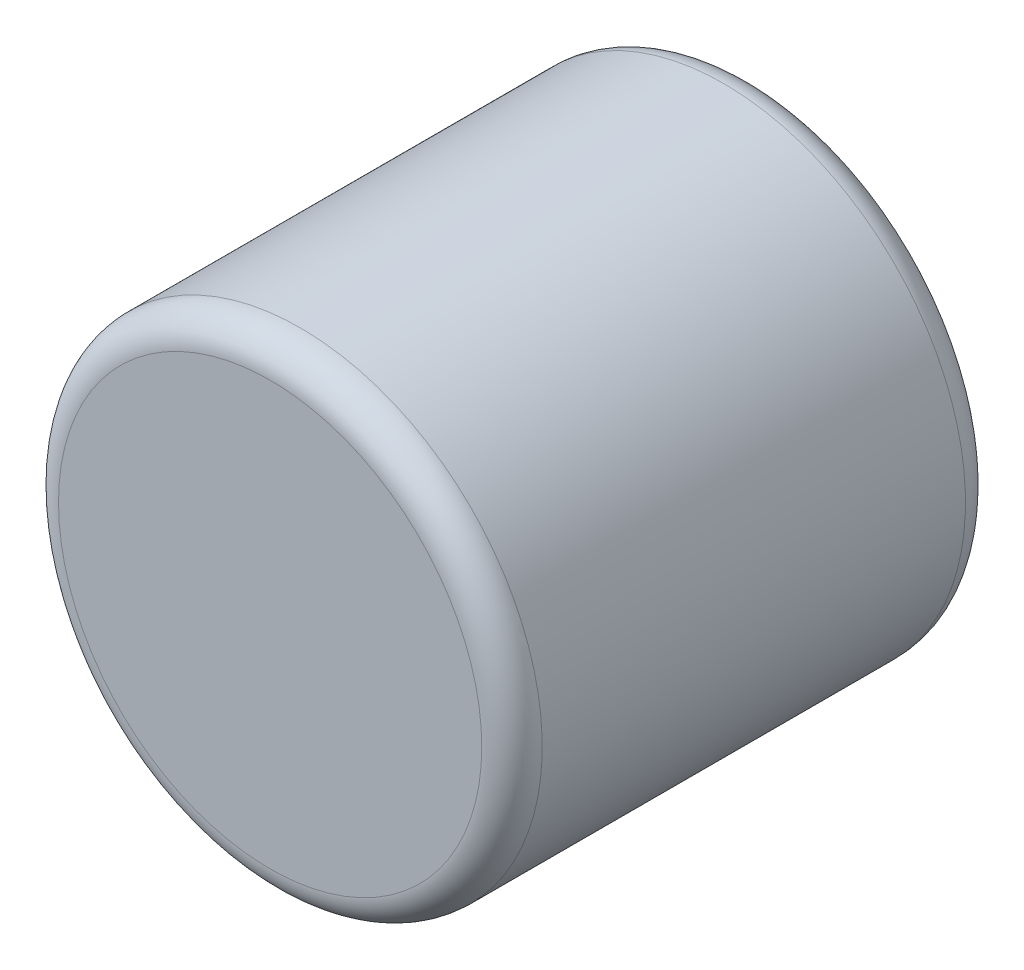
ISO-10303-21;
HEADER;
FILE_DESCRIPTION(('STEP AP214'),'2;1');
FILE_NAME('part.step','',(''),(''),'','','');
FILE_SCHEMA(('AUTOMOTIVE_DESIGN { 1 0 10303 214 1 1 1 1 }'));
ENDSEC;
DATA;
#1=APPLICATION_CONTEXT('core data for automotive mechanical design processes');
#2=APPLICATION_PROTOCOL_DEFINITION('international standard','automotive_design',2000,#1);
#3=PRODUCT_CONTEXT('',#1,'mechanical');
#4=PRODUCT('Part','Part','',(#3));
#5=PRODUCT_RELATED_PRODUCT_CATEGORY('part','',(#4));
#6=PRODUCT_DEFINITION_FORMATION('','',#4);
#7=PRODUCT_DEFINITION_CONTEXT('part definition',#1,'design');
#8=PRODUCT_DEFINITION('design','',#6,#7);
#9=PRODUCT_DEFINITION_SHAPE('','',#8);
#10=(LENGTH_UNIT() NAMED_UNIT(*) SI_UNIT(.MILLI.,.METRE.));
#11=(NAMED_UNIT(*) PLANE_ANGLE_UNIT() SI_UNIT($,.RADIAN.));
#12=(NAMED_UNIT(*) SI_UNIT($,.STERADIAN.) SOLID_ANGLE_UNIT());
#13=UNCERTAINTY_MEASURE_WITH_UNIT(LENGTH_MEASURE(1.E-05),#10,'distance_accuracy_value','');
#14=(GEOMETRIC_REPRESENTATION_CONTEXT(3) GLOBAL_UNCERTAINTY_ASSIGNED_CONTEXT((#13)) GLOBAL_UNIT_ASSIGNED_CONTEXT((#10,
#11,#12)) REPRESENTATION_CONTEXT('',''));
#15=CARTESIAN_POINT('',(0.,0.,0.));
#16=DIRECTION('',(0.,0.,1.));
#17=DIRECTION('',(1.,0.,0.));
#18=AXIS2_PLACEMENT_3D('',#15,#16,#17);
#19=CARTESIAN_POINT('',(0.,0.,8.));
#20=DIRECTION('',(0.,0.,1.));
#21=DIRECTION('',(1.,0.,0.));
#22=AXIS2_PLACEMENT_3D('',#19,#20,#21);
#23=PLANE('',#22);
#24=CARTESIAN_POINT('',(0.,0.,8.));
#25=DIRECTION('',(0.,0.,-1.));
#26=DIRECTION('',(-1.,0.,0.));
#27=AXIS2_PLACEMENT_3D('',#24,#25,#26);
#28=CIRCLE('',#27,3.5);
#29=CARTESIAN_POINT('',(-3.5,0.,8.));
#30=VERTEX_POINT('',#29);
#31=CARTESIAN_POINT('',(3.5,0.,8.));
#32=VERTEX_POINT('',#31);
#33=EDGE_CURVE('E49',#30,#32,#28,.T.);
#34=ORIENTED_EDGE('',*,*,#33,.F.);
#35=CARTESIAN_POINT('',(0.,0.,8.));
#36=DIRECTION('',(0.,0.,-1.));
#37=DIRECTION('',(1.,0.,0.));
#38=AXIS2_PLACEMENT_3D('',#35,#36,#37);
#39=CIRCLE('',#38,3.5);
#40=EDGE_CURVE('E45',#32,#30,#39,.T.);
#41=ORIENTED_EDGE('',*,*,#40,.F.);
#42=EDGE_LOOP('',(#34,#41));
#43=FACE_BOUND('',#42,.T.);
#44=ADVANCED_FACE('F16',(#43),#23,.T.);
#45=CARTESIAN_POINT('',(0.,0.,0.));
#46=DIRECTION('',(0.,0.,1.));
#47=DIRECTION('',(1.,0.,0.));
#48=AXIS2_PLACEMENT_3D('',#45,#46,#47);
#49=PLANE('',#48);
#50=CARTESIAN_POINT('',(0.,0.,0.));
#51=DIRECTION('',(0.,0.,1.));
#52=DIRECTION('',(1.,0.,0.));
#53=AXIS2_PLACEMENT_3D('',#50,#51,#52);
#54=CIRCLE('',#53,3.5);
#55=CARTESIAN_POINT('',(3.5,0.,0.));
#56=VERTEX_POINT('',#55);
#57=CARTESIAN_POINT('',(-3.5,0.,0.));
#58=VERTEX_POINT('',#57);
#59=EDGE_CURVE('E56',#56,#58,#54,.T.);
#60=ORIENTED_EDGE('',*,*,#59,.F.);
#61=CARTESIAN_POINT('',(0.,0.,0.));
#62=DIRECTION('',(0.,0.,1.));
#63=DIRECTION('',(-1.,0.,0.));
#64=AXIS2_PLACEMENT_3D('',#61,#62,#63);
#65=CIRCLE('',#64,3.5);
#66=EDGE_CURVE('E36',#58,#56,#65,.T.);
#67=ORIENTED_EDGE('',*,*,#66,.F.);
#68=EDGE_LOOP('',(#60,#67));
#69=FACE_BOUND('',#68,.T.);
#70=ADVANCED_FACE('F74',(#69),#49,.F.);
#71=CARTESIAN_POINT('',(0.,0.,7.5));
#72=DIRECTION('',(0.,0.,1.));
#73=DIRECTION('',(1.,0.,0.));
#74=AXIS2_PLACEMENT_3D('',#71,#72,#73);
#75=TOROIDAL_SURFACE('',#74,3.5,0.5);
#76=ORIENTED_EDGE('',*,*,#40,.T.);
#77=ORIENTED_EDGE('',*,*,#33,.T.);
#78=EDGE_LOOP('',(#76,#77));
#79=FACE_BOUND('',#78,.T.);
#80=CARTESIAN_POINT('',(0.,0.,7.5));
#81=DIRECTION('',(0.,0.,-1.));
#82=DIRECTION('',(-1.,0.,0.));
#83=AXIS2_PLACEMENT_3D('',#80,#81,#82);
#84=CIRCLE('',#83,4.);
#85=CARTESIAN_POINT('',(-4.,0.,7.5));
#86=VERTEX_POINT('',#85);
#87=EDGE_CURVE('E28',#86,#86,#84,.T.);
#88=ORIENTED_EDGE('',*,*,#87,.F.);
#89=EDGE_LOOP('',(#88));
#90=FACE_BOUND('',#89,.T.);
#91=ADVANCED_FACE('F54',(#79,#90),#75,.T.);
#92=CARTESIAN_POINT('',(0.,0.,0.5));
#93=DIRECTION('',(0.,0.,1.));
#94=DIRECTION('',(1.,0.,0.));
#95=AXIS2_PLACEMENT_3D('',#92,#93,#94);
#96=TOROIDAL_SURFACE('',#95,3.5,0.5);
#97=CARTESIAN_POINT('',(0.,0.,0.5));
#98=DIRECTION('',(0.,0.,-1.));
#99=DIRECTION('',(-1.,0.,0.));
#100=AXIS2_PLACEMENT_3D('',#97,#98,#99);
#101=CIRCLE('',#100,4.);
#102=CARTESIAN_POINT('',(-4.,0.,0.5));
#103=VERTEX_POINT('',#102);
#104=EDGE_CURVE('E11',#103,#103,#101,.F.);
#105=ORIENTED_EDGE('',*,*,#104,.F.);
#106=EDGE_LOOP('',(#105));
#107=FACE_BOUND('',#106,.T.);
#108=ORIENTED_EDGE('',*,*,#59,.T.);
#109=ORIENTED_EDGE('',*,*,#66,.T.);
#110=EDGE_LOOP('',(#108,#109));
#111=FACE_BOUND('',#110,.T.);
#112=ADVANCED_FACE('F73',(#107,#111),#96,.T.);
#113=CARTESIAN_POINT('',(0.,0.,8.));
#114=DIRECTION('',(0.,0.,-1.));
#115=DIRECTION('',(-1.,0.,0.));
#116=AXIS2_PLACEMENT_3D('',#113,#114,#115);
#117=CYLINDRICAL_SURFACE('',#116,4.);
#118=ORIENTED_EDGE('',*,*,#104,.T.);
#119=EDGE_LOOP('',(#118));
#120=FACE_BOUND('',#119,.T.);
#121=ORIENTED_EDGE('',*,*,#87,.T.);
#122=EDGE_LOOP('',(#121));
#123=FACE_BOUND('',#122,.T.);
#124=ADVANCED_FACE('F119',(#120,#123),#117,.T.);
#125=CLOSED_SHELL('',(#44,#70,#91,#112,#124));
#126=MANIFOLD_SOLID_BREP('B1',#125);
#127=ADVANCED_BREP_SHAPE_REPRESENTATION('',(#18,#126),#14);
#128=SHAPE_DEFINITION_REPRESENTATION(#9,#127);
ENDSEC;
END-ISO-10303-21;
